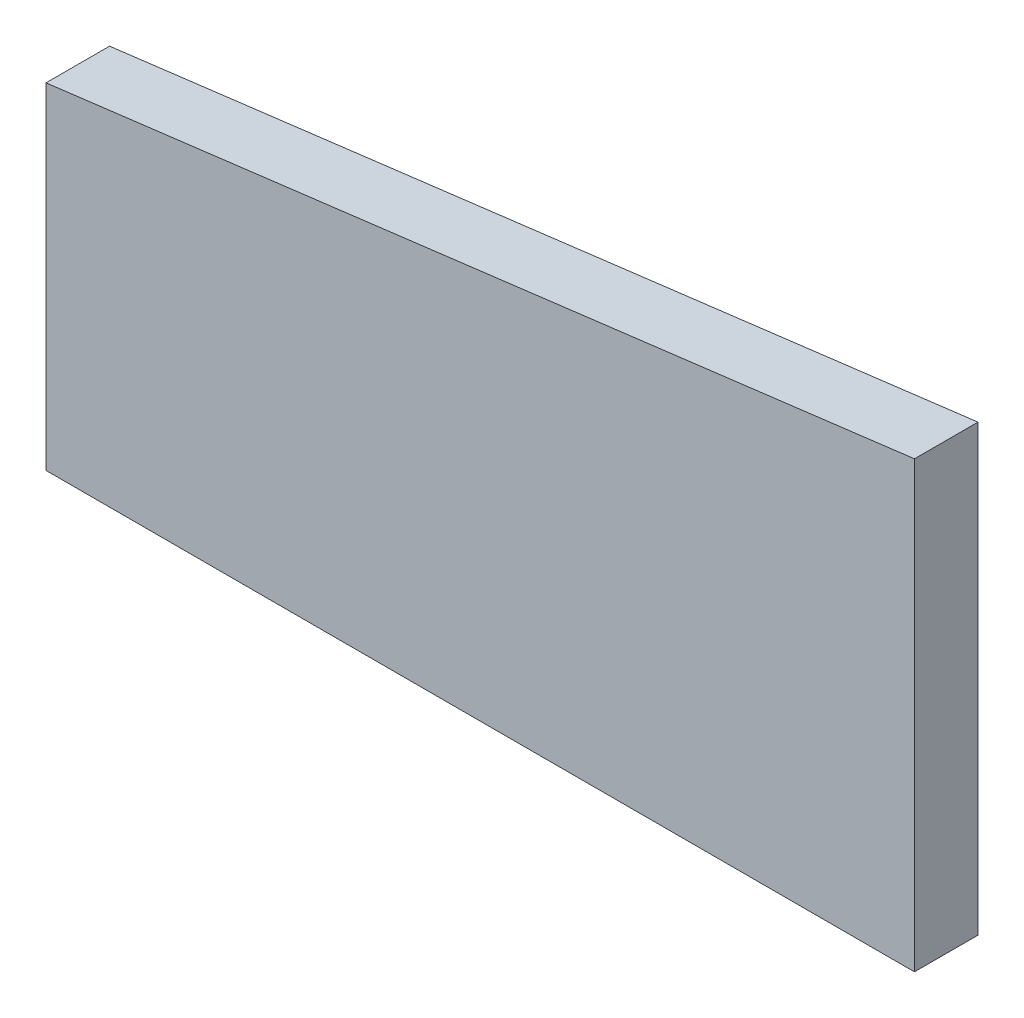
ISO-10303-21;
HEADER;
FILE_DESCRIPTION(('STEP AP214'),'2;1');
FILE_NAME('part.step','',(''),(''),'','','');
FILE_SCHEMA(('AUTOMOTIVE_DESIGN { 1 0 10303 214 1 1 1 1 }'));
ENDSEC;
DATA;
#1=APPLICATION_CONTEXT('core data for automotive mechanical design processes');
#2=APPLICATION_PROTOCOL_DEFINITION('international standard','automotive_design',2000,#1);
#3=PRODUCT_CONTEXT('',#1,'mechanical');
#4=PRODUCT('Part','Part','',(#3));
#5=PRODUCT_RELATED_PRODUCT_CATEGORY('part','',(#4));
#6=PRODUCT_DEFINITION_FORMATION('','',#4);
#7=PRODUCT_DEFINITION_CONTEXT('part definition',#1,'design');
#8=PRODUCT_DEFINITION('design','',#6,#7);
#9=PRODUCT_DEFINITION_SHAPE('','',#8);
#10=(LENGTH_UNIT() NAMED_UNIT(*) SI_UNIT(.MILLI.,.METRE.));
#11=(NAMED_UNIT(*) PLANE_ANGLE_UNIT() SI_UNIT($,.RADIAN.));
#12=(NAMED_UNIT(*) SI_UNIT($,.STERADIAN.) SOLID_ANGLE_UNIT());
#13=UNCERTAINTY_MEASURE_WITH_UNIT(LENGTH_MEASURE(1.E-05),#10,'distance_accuracy_value','');
#14=(GEOMETRIC_REPRESENTATION_CONTEXT(3) GLOBAL_UNCERTAINTY_ASSIGNED_CONTEXT((#13)) GLOBAL_UNIT_ASSIGNED_CONTEXT((#10,
#11,#12)) REPRESENTATION_CONTEXT('',''));
#15=CARTESIAN_POINT('',(0.,0.,0.));
#16=DIRECTION('',(0.,0.,1.));
#17=DIRECTION('',(1.,0.,0.));
#18=AXIS2_PLACEMENT_3D('',#15,#16,#17);
#19=CARTESIAN_POINT('',(486.786295427458,3.54620310535137E-13,19.05));
#20=DIRECTION('',(-1.,0.,0.));
#21=DIRECTION('',(0.,-1.,0.));
#22=AXIS2_PLACEMENT_3D('',#19,#20,#21);
#23=PLANE('',#22);
#24=DIRECTION('',(0.,1.,0.));
#25=VECTOR('',#24,1.);
#26=CARTESIAN_POINT('',(486.786295427458,3.54620310535137E-13,0.));
#27=LINE('',#26,#25);
#28=CARTESIAN_POINT('',(486.786295427458,27.1946714703701,0.));
#29=VERTEX_POINT('',#28);
#30=CARTESIAN_POINT('',(486.786295427458,160.396225773722,0.));
#31=VERTEX_POINT('',#30);
#32=EDGE_CURVE('E98',#29,#31,#27,.T.);
#33=ORIENTED_EDGE('',*,*,#32,.T.);
#34=DIRECTION('',(0.,0.,-1.));
#35=VECTOR('',#34,1.);
#36=CARTESIAN_POINT('',(486.786295427458,160.396225773722,19.05));
#37=LINE('',#36,#35);
#38=CARTESIAN_POINT('',(486.786295427458,160.396225773722,19.05));
#39=VERTEX_POINT('',#38);
#40=EDGE_CURVE('E11',#39,#31,#37,.T.);
#41=ORIENTED_EDGE('',*,*,#40,.F.);
#42=DIRECTION('',(0.,1.,0.));
#43=VECTOR('',#42,1.);
#44=CARTESIAN_POINT('',(486.786295427458,3.54620310535137E-13,19.05));
#45=LINE('',#44,#43);
#46=CARTESIAN_POINT('',(486.786295427458,27.1946714703701,19.05));
#47=VERTEX_POINT('',#46);
#48=EDGE_CURVE('E86',#47,#39,#45,.T.);
#49=ORIENTED_EDGE('',*,*,#48,.F.);
#50=DIRECTION('',(0.,0.,-1.));
#51=VECTOR('',#50,1.);
#52=CARTESIAN_POINT('',(486.786295427458,27.1946714703701,19.05));
#53=LINE('',#52,#51);
#54=EDGE_CURVE('E94',#47,#29,#53,.T.);
#55=ORIENTED_EDGE('',*,*,#54,.T.);
#56=EDGE_LOOP('',(#33,#41,#49,#55));
#57=FACE_BOUND('',#56,.T.);
#58=ADVANCED_FACE('F35',(#57),#23,.F.);
#59=CARTESIAN_POINT('',(-12.2549370215559,97.9750202610744,19.05));
#60=DIRECTION('',(0.12411510301651,-0.992267827354692,0.));
#61=DIRECTION('',(0.992267827354692,0.12411510301651,0.));
#62=AXIS2_PLACEMENT_3D('',#59,#60,#61);
#63=PLANE('',#62);
#64=DIRECTION('',(-0.992267827354692,-0.12411510301651,0.));
#65=VECTOR('',#64,1.);
#66=CARTESIAN_POINT('',(-12.2549370215559,97.9750202610744,0.));
#67=LINE('',#66,#65);
#68=CARTESIAN_POINT('',(226.436295427458,127.831059213305,0.));
#69=VERTEX_POINT('',#68);
#70=EDGE_CURVE('E90',#31,#69,#67,.T.);
#71=ORIENTED_EDGE('',*,*,#70,.T.);
#72=DIRECTION('',(0.,0.,-1.));
#73=VECTOR('',#72,1.);
#74=CARTESIAN_POINT('',(226.436295427458,127.831059213305,19.05));
#75=LINE('',#74,#73);
#76=CARTESIAN_POINT('',(226.436295427458,127.831059213305,19.05));
#77=VERTEX_POINT('',#76);
#78=EDGE_CURVE('E43',#77,#69,#75,.T.);
#79=ORIENTED_EDGE('',*,*,#78,.F.);
#80=DIRECTION('',(-0.992267827354692,-0.12411510301651,0.));
#81=VECTOR('',#80,1.);
#82=CARTESIAN_POINT('',(-12.2549370215559,97.9750202610744,19.05));
#83=LINE('',#82,#81);
#84=EDGE_CURVE('E81',#39,#77,#83,.T.);
#85=ORIENTED_EDGE('',*,*,#84,.F.);
#86=ORIENTED_EDGE('',*,*,#40,.T.);
#87=EDGE_LOOP('',(#71,#79,#85,#86));
#88=FACE_BOUND('',#87,.T.);
#89=ADVANCED_FACE('F89',(#88),#63,.F.);
#90=CARTESIAN_POINT('',(226.436295427458,0.,19.05));
#91=DIRECTION('',(1.,0.,0.));
#92=DIRECTION('',(0.,0.,-1.));
#93=AXIS2_PLACEMENT_3D('',#90,#91,#92);
#94=PLANE('',#93);
#95=DIRECTION('',(0.,-1.,0.));
#96=VECTOR('',#95,1.);
#97=CARTESIAN_POINT('',(226.436295427458,0.,0.));
#98=LINE('',#97,#96);
#99=CARTESIAN_POINT('',(226.436295427458,27.1946714703701,0.));
#100=VERTEX_POINT('',#99);
#101=EDGE_CURVE('E68',#69,#100,#98,.T.);
#102=ORIENTED_EDGE('',*,*,#101,.T.);
#103=DIRECTION('',(0.,0.,-1.));
#104=VECTOR('',#103,1.);
#105=CARTESIAN_POINT('',(226.436295427458,27.1946714703701,19.05));
#106=LINE('',#105,#104);
#107=CARTESIAN_POINT('',(226.436295427458,27.1946714703701,19.05));
#108=VERTEX_POINT('',#107);
#109=EDGE_CURVE('E91',#108,#100,#106,.T.);
#110=ORIENTED_EDGE('',*,*,#109,.F.);
#111=DIRECTION('',(0.,-1.,0.));
#112=VECTOR('',#111,1.);
#113=CARTESIAN_POINT('',(226.436295427458,0.,19.05));
#114=LINE('',#113,#112);
#115=EDGE_CURVE('E84',#77,#108,#114,.T.);
#116=ORIENTED_EDGE('',*,*,#115,.F.);
#117=ORIENTED_EDGE('',*,*,#78,.T.);
#118=EDGE_LOOP('',(#102,#110,#116,#117));
#119=FACE_BOUND('',#118,.T.);
#120=ADVANCED_FACE('F92',(#119),#94,.F.);
#121=CARTESIAN_POINT('',(0.,27.1946714703701,19.05));
#122=DIRECTION('',(0.,1.,0.));
#123=DIRECTION('',(0.,0.,1.));
#124=AXIS2_PLACEMENT_3D('',#121,#122,#123);
#125=PLANE('',#124);
#126=DIRECTION('',(1.,0.,0.));
#127=VECTOR('',#126,1.);
#128=CARTESIAN_POINT('',(0.,27.1946714703701,0.));
#129=LINE('',#128,#127);
#130=EDGE_CURVE('E74',#100,#29,#129,.T.);
#131=ORIENTED_EDGE('',*,*,#130,.T.);
#132=ORIENTED_EDGE('',*,*,#54,.F.);
#133=DIRECTION('',(1.,0.,0.));
#134=VECTOR('',#133,1.);
#135=CARTESIAN_POINT('',(0.,27.1946714703701,19.05));
#136=LINE('',#135,#134);
#137=EDGE_CURVE('E51',#108,#47,#136,.T.);
#138=ORIENTED_EDGE('',*,*,#137,.F.);
#139=ORIENTED_EDGE('',*,*,#109,.T.);
#140=EDGE_LOOP('',(#131,#132,#138,#139));
#141=FACE_BOUND('',#140,.T.);
#142=ADVANCED_FACE('F105',(#141),#125,.F.);
#143=CARTESIAN_POINT('',(0.,0.,19.05));
#144=DIRECTION('',(0.,0.,1.));
#145=DIRECTION('',(1.,0.,0.));
#146=AXIS2_PLACEMENT_3D('',#143,#144,#145);
#147=PLANE('',#146);
#148=ORIENTED_EDGE('',*,*,#48,.T.);
#149=ORIENTED_EDGE('',*,*,#84,.T.);
#150=ORIENTED_EDGE('',*,*,#115,.T.);
#151=ORIENTED_EDGE('',*,*,#137,.T.);
#152=EDGE_LOOP('',(#148,#149,#150,#151));
#153=FACE_BOUND('',#152,.T.);
#154=ADVANCED_FACE('F82',(#153),#147,.T.);
#155=CARTESIAN_POINT('',(0.,0.,0.));
#156=DIRECTION('',(0.,0.,1.));
#157=DIRECTION('',(1.,0.,0.));
#158=AXIS2_PLACEMENT_3D('',#155,#156,#157);
#159=PLANE('',#158);
#160=ORIENTED_EDGE('',*,*,#32,.F.);
#161=ORIENTED_EDGE('',*,*,#130,.F.);
#162=ORIENTED_EDGE('',*,*,#101,.F.);
#163=ORIENTED_EDGE('',*,*,#70,.F.);
#164=EDGE_LOOP('',(#160,#161,#162,#163));
#165=FACE_BOUND('',#164,.T.);
#166=ADVANCED_FACE('F108',(#165),#159,.F.);
#167=CLOSED_SHELL('',(#58,#89,#120,#142,#154,#166));
#168=MANIFOLD_SOLID_BREP('B2',#167);
#169=ADVANCED_BREP_SHAPE_REPRESENTATION('',(#18,#168),#14);
#170=SHAPE_DEFINITION_REPRESENTATION(#9,#169);
ENDSEC;
END-ISO-10303-21;
